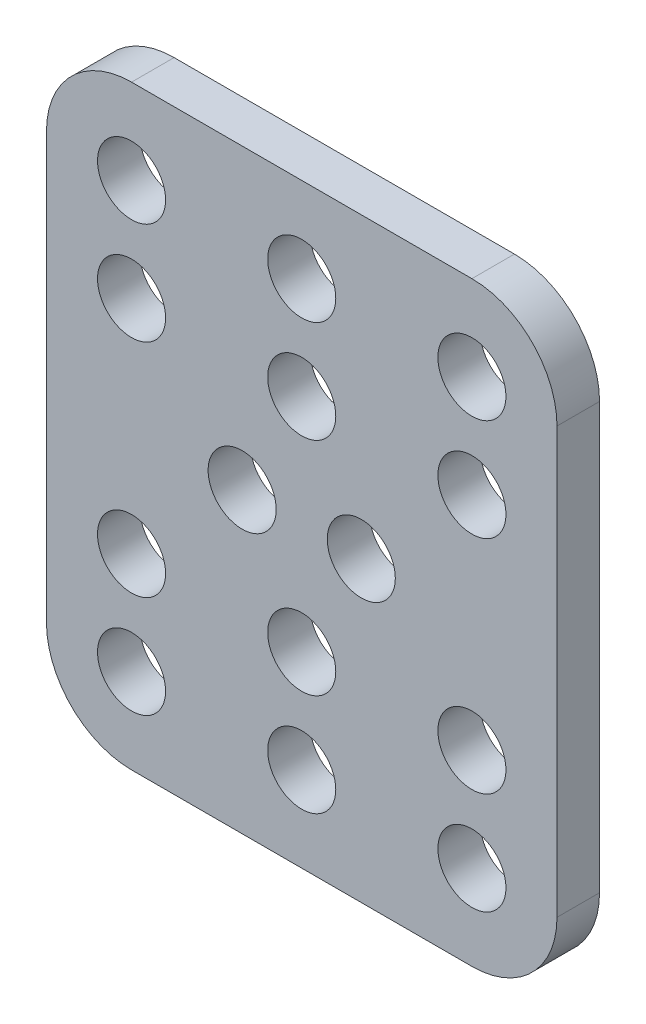
ISO-10303-21;
HEADER;
FILE_DESCRIPTION(('STEP AP214'),'2;1');
FILE_NAME('part.step','',(''),(''),'','','');
FILE_SCHEMA(('AUTOMOTIVE_DESIGN { 1 0 10303 214 1 1 1 1 }'));
ENDSEC;
DATA;
#1=APPLICATION_CONTEXT('core data for automotive mechanical design processes');
#2=APPLICATION_PROTOCOL_DEFINITION('international standard','automotive_design',2000,#1);
#3=PRODUCT_CONTEXT('',#1,'mechanical');
#4=PRODUCT('Part','Part','',(#3));
#5=PRODUCT_RELATED_PRODUCT_CATEGORY('part','',(#4));
#6=PRODUCT_DEFINITION_FORMATION('','',#4);
#7=PRODUCT_DEFINITION_CONTEXT('part definition',#1,'design');
#8=PRODUCT_DEFINITION('design','',#6,#7);
#9=PRODUCT_DEFINITION_SHAPE('','',#8);
#10=(LENGTH_UNIT() NAMED_UNIT(*) SI_UNIT(.MILLI.,.METRE.));
#11=(NAMED_UNIT(*) PLANE_ANGLE_UNIT() SI_UNIT($,.RADIAN.));
#12=(NAMED_UNIT(*) SI_UNIT($,.STERADIAN.) SOLID_ANGLE_UNIT());
#13=UNCERTAINTY_MEASURE_WITH_UNIT(LENGTH_MEASURE(1.E-05),#10,'distance_accuracy_value','');
#14=(GEOMETRIC_REPRESENTATION_CONTEXT(3) GLOBAL_UNCERTAINTY_ASSIGNED_CONTEXT((#13)) GLOBAL_UNIT_ASSIGNED_CONTEXT((#10,
#11,#12)) REPRESENTATION_CONTEXT('',''));
#15=CARTESIAN_POINT('',(0.,0.,0.));
#16=DIRECTION('',(0.,0.,1.));
#17=DIRECTION('',(1.,0.,0.));
#18=AXIS2_PLACEMENT_3D('',#15,#16,#17);
#19=CARTESIAN_POINT('',(-20.,-25.,5.));
#20=DIRECTION('',(0.,0.,1.));
#21=DIRECTION('',(1.,0.,0.));
#22=AXIS2_PLACEMENT_3D('',#19,#20,#21);
#23=PLANE('',#22);
#24=CARTESIAN_POINT('',(0.,13.,5.));
#25=DIRECTION('',(0.,0.,1.));
#26=DIRECTION('',(1.,0.,0.));
#27=AXIS2_PLACEMENT_3D('',#24,#25,#26);
#28=CIRCLE('',#27,4.);
#29=CARTESIAN_POINT('',(4.,13.,5.));
#30=VERTEX_POINT('',#29);
#31=EDGE_CURVE('E252',#30,#30,#28,.T.);
#32=ORIENTED_EDGE('',*,*,#31,.F.);
#33=EDGE_LOOP('',(#32));
#34=FACE_BOUND('',#33,.T.);
#35=CARTESIAN_POINT('',(20.,-13.,5.));
#36=DIRECTION('',(0.,0.,1.));
#37=DIRECTION('',(1.,0.,0.));
#38=AXIS2_PLACEMENT_3D('',#35,#36,#37);
#39=CIRCLE('',#38,4.);
#40=CARTESIAN_POINT('',(24.,-13.,5.));
#41=VERTEX_POINT('',#40);
#42=EDGE_CURVE('E240',#41,#41,#39,.T.);
#43=ORIENTED_EDGE('',*,*,#42,.F.);
#44=EDGE_LOOP('',(#43));
#45=FACE_BOUND('',#44,.T.);
#46=CARTESIAN_POINT('',(0.,25.,5.));
#47=DIRECTION('',(0.,0.,1.));
#48=DIRECTION('',(1.,0.,0.));
#49=AXIS2_PLACEMENT_3D('',#46,#47,#48);
#50=CIRCLE('',#49,4.);
#51=CARTESIAN_POINT('',(4.,25.,5.));
#52=VERTEX_POINT('',#51);
#53=EDGE_CURVE('E228',#52,#52,#50,.T.);
#54=ORIENTED_EDGE('',*,*,#53,.F.);
#55=EDGE_LOOP('',(#54));
#56=FACE_BOUND('',#55,.T.);
#57=CARTESIAN_POINT('',(0.,-25.,5.));
#58=DIRECTION('',(0.,0.,1.));
#59=DIRECTION('',(1.,0.,0.));
#60=AXIS2_PLACEMENT_3D('',#57,#58,#59);
#61=CIRCLE('',#60,4.);
#62=CARTESIAN_POINT('',(4.,-25.,5.));
#63=VERTEX_POINT('',#62);
#64=EDGE_CURVE('E216',#63,#63,#61,.T.);
#65=ORIENTED_EDGE('',*,*,#64,.F.);
#66=EDGE_LOOP('',(#65));
#67=FACE_BOUND('',#66,.T.);
#68=CARTESIAN_POINT('',(-20.,-25.,5.));
#69=DIRECTION('',(0.,0.,1.));
#70=DIRECTION('',(1.,0.,0.));
#71=AXIS2_PLACEMENT_3D('',#68,#69,#70);
#72=CIRCLE('',#71,4.);
#73=CARTESIAN_POINT('',(-16.,-25.,5.));
#74=VERTEX_POINT('',#73);
#75=EDGE_CURVE('E204',#74,#74,#72,.T.);
#76=ORIENTED_EDGE('',*,*,#75,.F.);
#77=EDGE_LOOP('',(#76));
#78=FACE_BOUND('',#77,.T.);
#79=CARTESIAN_POINT('',(-20.,25.,5.));
#80=DIRECTION('',(0.,0.,1.));
#81=DIRECTION('',(1.,0.,0.));
#82=AXIS2_PLACEMENT_3D('',#79,#80,#81);
#83=CIRCLE('',#82,4.);
#84=CARTESIAN_POINT('',(-16.,25.,5.));
#85=VERTEX_POINT('',#84);
#86=EDGE_CURVE('E192',#85,#85,#83,.T.);
#87=ORIENTED_EDGE('',*,*,#86,.F.);
#88=EDGE_LOOP('',(#87));
#89=FACE_BOUND('',#88,.T.);
#90=CARTESIAN_POINT('',(7.,0.,5.));
#91=DIRECTION('',(0.,0.,1.));
#92=DIRECTION('',(1.,0.,0.));
#93=AXIS2_PLACEMENT_3D('',#90,#91,#92);
#94=CIRCLE('',#93,4.);
#95=CARTESIAN_POINT('',(11.,0.,5.));
#96=VERTEX_POINT('',#95);
#97=EDGE_CURVE('E138',#96,#96,#94,.T.);
#98=ORIENTED_EDGE('',*,*,#97,.F.);
#99=EDGE_LOOP('',(#98));
#100=FACE_BOUND('',#99,.T.);
#101=CARTESIAN_POINT('',(-20.,-25.,5.));
#102=DIRECTION('',(0.,0.,1.));
#103=DIRECTION('',(1.,0.,0.));
#104=AXIS2_PLACEMENT_3D('',#101,#102,#103);
#105=CIRCLE('',#104,10.);
#106=CARTESIAN_POINT('',(-30.,-24.9999999999999,5.));
#107=VERTEX_POINT('',#106);
#108=CARTESIAN_POINT('',(-19.9999999999999,-35.,5.));
#109=VERTEX_POINT('',#108);
#110=EDGE_CURVE('E149',#107,#109,#105,.T.);
#111=ORIENTED_EDGE('',*,*,#110,.T.);
#112=DIRECTION('',(1.,0.,0.));
#113=VECTOR('',#112,1.);
#114=CARTESIAN_POINT('',(-19.9999999999999,-35.,5.));
#115=LINE('',#114,#113);
#116=CARTESIAN_POINT('',(19.9999999999999,-35.,5.));
#117=VERTEX_POINT('',#116);
#118=EDGE_CURVE('E97',#109,#117,#115,.T.);
#119=ORIENTED_EDGE('',*,*,#118,.T.);
#120=CARTESIAN_POINT('',(20.,-25.,5.));
#121=DIRECTION('',(0.,0.,1.));
#122=DIRECTION('',(1.,0.,0.));
#123=AXIS2_PLACEMENT_3D('',#120,#121,#122);
#124=CIRCLE('',#123,10.);
#125=CARTESIAN_POINT('',(30.,-24.9999999999999,5.));
#126=VERTEX_POINT('',#125);
#127=EDGE_CURVE('E164',#117,#126,#124,.T.);
#128=ORIENTED_EDGE('',*,*,#127,.T.);
#129=DIRECTION('',(0.,1.,0.));
#130=VECTOR('',#129,1.);
#131=CARTESIAN_POINT('',(30.,24.9999999999999,5.));
#132=LINE('',#131,#130);
#133=CARTESIAN_POINT('',(30.,24.9999999999999,5.));
#134=VERTEX_POINT('',#133);
#135=EDGE_CURVE('E177',#126,#134,#132,.T.);
#136=ORIENTED_EDGE('',*,*,#135,.T.);
#137=CARTESIAN_POINT('',(20.,25.,5.));
#138=DIRECTION('',(0.,0.,1.));
#139=DIRECTION('',(-1.,0.,0.));
#140=AXIS2_PLACEMENT_3D('',#137,#138,#139);
#141=CIRCLE('',#140,10.);
#142=CARTESIAN_POINT('',(19.9999999999999,35.,5.));
#143=VERTEX_POINT('',#142);
#144=EDGE_CURVE('E116',#134,#143,#141,.T.);
#145=ORIENTED_EDGE('',*,*,#144,.T.);
#146=DIRECTION('',(-1.,0.,0.));
#147=VECTOR('',#146,1.);
#148=CARTESIAN_POINT('',(-19.9999999999999,35.,5.));
#149=LINE('',#148,#147);
#150=CARTESIAN_POINT('',(-19.9999999999999,35.,5.));
#151=VERTEX_POINT('',#150);
#152=EDGE_CURVE('E110',#143,#151,#149,.T.);
#153=ORIENTED_EDGE('',*,*,#152,.T.);
#154=CARTESIAN_POINT('',(-20.,25.,5.));
#155=DIRECTION('',(0.,0.,1.));
#156=DIRECTION('',(1.,0.,0.));
#157=AXIS2_PLACEMENT_3D('',#154,#155,#156);
#158=CIRCLE('',#157,10.);
#159=CARTESIAN_POINT('',(-30.,24.9999999999999,5.));
#160=VERTEX_POINT('',#159);
#161=EDGE_CURVE('E114',#151,#160,#158,.T.);
#162=ORIENTED_EDGE('',*,*,#161,.T.);
#163=DIRECTION('',(0.,-1.,0.));
#164=VECTOR('',#163,1.);
#165=CARTESIAN_POINT('',(-30.,24.9999999999999,5.));
#166=LINE('',#165,#164);
#167=EDGE_CURVE('E54',#160,#107,#166,.T.);
#168=ORIENTED_EDGE('',*,*,#167,.T.);
#169=EDGE_LOOP('',(#111,#119,#128,#136,#145,#153,#162,#168));
#170=FACE_BOUND('',#169,.T.);
#171=CARTESIAN_POINT('',(-7.,0.,5.));
#172=DIRECTION('',(0.,0.,1.));
#173=DIRECTION('',(1.,0.,0.));
#174=AXIS2_PLACEMENT_3D('',#171,#172,#173);
#175=CIRCLE('',#174,4.);
#176=CARTESIAN_POINT('',(-3.,0.,5.));
#177=VERTEX_POINT('',#176);
#178=EDGE_CURVE('E186',#177,#177,#175,.T.);
#179=ORIENTED_EDGE('',*,*,#178,.F.);
#180=EDGE_LOOP('',(#179));
#181=FACE_BOUND('',#180,.T.);
#182=CARTESIAN_POINT('',(20.,25.,5.));
#183=DIRECTION('',(0.,0.,1.));
#184=DIRECTION('',(1.,0.,0.));
#185=AXIS2_PLACEMENT_3D('',#182,#183,#184);
#186=CIRCLE('',#185,4.);
#187=CARTESIAN_POINT('',(24.,25.,5.));
#188=VERTEX_POINT('',#187);
#189=EDGE_CURVE('E198',#188,#188,#186,.T.);
#190=ORIENTED_EDGE('',*,*,#189,.F.);
#191=EDGE_LOOP('',(#190));
#192=FACE_BOUND('',#191,.T.);
#193=CARTESIAN_POINT('',(20.,-25.,5.));
#194=DIRECTION('',(0.,0.,1.));
#195=DIRECTION('',(1.,0.,0.));
#196=AXIS2_PLACEMENT_3D('',#193,#194,#195);
#197=CIRCLE('',#196,4.);
#198=CARTESIAN_POINT('',(24.,-25.,5.));
#199=VERTEX_POINT('',#198);
#200=EDGE_CURVE('E210',#199,#199,#197,.T.);
#201=ORIENTED_EDGE('',*,*,#200,.F.);
#202=EDGE_LOOP('',(#201));
#203=FACE_BOUND('',#202,.T.);
#204=CARTESIAN_POINT('',(0.,-13.,5.));
#205=DIRECTION('',(0.,0.,1.));
#206=DIRECTION('',(1.,0.,0.));
#207=AXIS2_PLACEMENT_3D('',#204,#205,#206);
#208=CIRCLE('',#207,4.);
#209=CARTESIAN_POINT('',(4.,-13.,5.));
#210=VERTEX_POINT('',#209);
#211=EDGE_CURVE('E222',#210,#210,#208,.T.);
#212=ORIENTED_EDGE('',*,*,#211,.F.);
#213=EDGE_LOOP('',(#212));
#214=FACE_BOUND('',#213,.T.);
#215=CARTESIAN_POINT('',(-20.,-13.,5.));
#216=DIRECTION('',(0.,0.,1.));
#217=DIRECTION('',(1.,0.,0.));
#218=AXIS2_PLACEMENT_3D('',#215,#216,#217);
#219=CIRCLE('',#218,4.);
#220=CARTESIAN_POINT('',(-16.,-13.,5.));
#221=VERTEX_POINT('',#220);
#222=EDGE_CURVE('E234',#221,#221,#219,.T.);
#223=ORIENTED_EDGE('',*,*,#222,.F.);
#224=EDGE_LOOP('',(#223));
#225=FACE_BOUND('',#224,.T.);
#226=CARTESIAN_POINT('',(-20.,13.,5.));
#227=DIRECTION('',(0.,0.,1.));
#228=DIRECTION('',(1.,0.,0.));
#229=AXIS2_PLACEMENT_3D('',#226,#227,#228);
#230=CIRCLE('',#229,4.);
#231=CARTESIAN_POINT('',(-16.,13.,5.));
#232=VERTEX_POINT('',#231);
#233=EDGE_CURVE('E246',#232,#232,#230,.T.);
#234=ORIENTED_EDGE('',*,*,#233,.F.);
#235=EDGE_LOOP('',(#234));
#236=FACE_BOUND('',#235,.T.);
#237=CARTESIAN_POINT('',(20.,13.,5.));
#238=DIRECTION('',(0.,0.,1.));
#239=DIRECTION('',(1.,0.,0.));
#240=AXIS2_PLACEMENT_3D('',#237,#238,#239);
#241=CIRCLE('',#240,4.);
#242=CARTESIAN_POINT('',(24.,13.,5.));
#243=VERTEX_POINT('',#242);
#244=EDGE_CURVE('E258',#243,#243,#241,.T.);
#245=ORIENTED_EDGE('',*,*,#244,.F.);
#246=EDGE_LOOP('',(#245));
#247=FACE_BOUND('',#246,.T.);
#248=ADVANCED_FACE('F37',(#34,#45,#56,#67,#78,#89,#100,#170,#181,#192,#203,#214,#225,#236,#247),
#23,.T.);
#249=CARTESIAN_POINT('',(-20.,-25.,0.));
#250=DIRECTION('',(0.,0.,1.));
#251=DIRECTION('',(1.,0.,0.));
#252=AXIS2_PLACEMENT_3D('',#249,#250,#251);
#253=PLANE('',#252);
#254=CARTESIAN_POINT('',(-20.,-25.,0.));
#255=DIRECTION('',(0.,0.,1.));
#256=DIRECTION('',(1.,0.,0.));
#257=AXIS2_PLACEMENT_3D('',#254,#255,#256);
#258=CIRCLE('',#257,10.);
#259=CARTESIAN_POINT('',(-30.,-24.9999999999999,0.));
#260=VERTEX_POINT('',#259);
#261=CARTESIAN_POINT('',(-19.9999999999999,-35.,0.));
#262=VERTEX_POINT('',#261);
#263=EDGE_CURVE('E134',#260,#262,#258,.T.);
#264=ORIENTED_EDGE('',*,*,#263,.F.);
#265=DIRECTION('',(0.,-1.,0.));
#266=VECTOR('',#265,1.);
#267=CARTESIAN_POINT('',(-30.,24.9999999999999,0.));
#268=LINE('',#267,#266);
#269=CARTESIAN_POINT('',(-30.,24.9999999999999,0.));
#270=VERTEX_POINT('',#269);
#271=EDGE_CURVE('E89',#270,#260,#268,.T.);
#272=ORIENTED_EDGE('',*,*,#271,.F.);
#273=CARTESIAN_POINT('',(-20.,25.,0.));
#274=DIRECTION('',(0.,0.,1.));
#275=DIRECTION('',(1.,0.,0.));
#276=AXIS2_PLACEMENT_3D('',#273,#274,#275);
#277=CIRCLE('',#276,10.);
#278=CARTESIAN_POINT('',(-19.9999999999999,35.,0.));
#279=VERTEX_POINT('',#278);
#280=EDGE_CURVE('E83',#279,#270,#277,.T.);
#281=ORIENTED_EDGE('',*,*,#280,.F.);
#282=DIRECTION('',(-1.,0.,0.));
#283=VECTOR('',#282,1.);
#284=CARTESIAN_POINT('',(-19.9999999999999,35.,0.));
#285=LINE('',#284,#283);
#286=CARTESIAN_POINT('',(19.9999999999999,35.,0.));
#287=VERTEX_POINT('',#286);
#288=EDGE_CURVE('E124',#287,#279,#285,.T.);
#289=ORIENTED_EDGE('',*,*,#288,.F.);
#290=CARTESIAN_POINT('',(20.,25.,0.));
#291=DIRECTION('',(0.,0.,1.));
#292=DIRECTION('',(-1.,0.,0.));
#293=AXIS2_PLACEMENT_3D('',#290,#291,#292);
#294=CIRCLE('',#293,10.);
#295=CARTESIAN_POINT('',(30.,24.9999999999999,0.));
#296=VERTEX_POINT('',#295);
#297=EDGE_CURVE('E144',#296,#287,#294,.T.);
#298=ORIENTED_EDGE('',*,*,#297,.F.);
#299=DIRECTION('',(0.,1.,0.));
#300=VECTOR('',#299,1.);
#301=CARTESIAN_POINT('',(30.,24.9999999999999,0.));
#302=LINE('',#301,#300);
#303=CARTESIAN_POINT('',(30.,-24.9999999999999,0.));
#304=VERTEX_POINT('',#303);
#305=EDGE_CURVE('E142',#304,#296,#302,.T.);
#306=ORIENTED_EDGE('',*,*,#305,.F.);
#307=CARTESIAN_POINT('',(20.,-25.,0.));
#308=DIRECTION('',(0.,0.,1.));
#309=DIRECTION('',(1.,0.,0.));
#310=AXIS2_PLACEMENT_3D('',#307,#308,#309);
#311=CIRCLE('',#310,10.);
#312=CARTESIAN_POINT('',(19.9999999999999,-35.,0.));
#313=VERTEX_POINT('',#312);
#314=EDGE_CURVE('E140',#313,#304,#311,.T.);
#315=ORIENTED_EDGE('',*,*,#314,.F.);
#316=DIRECTION('',(1.,0.,0.));
#317=VECTOR('',#316,1.);
#318=CARTESIAN_POINT('',(-19.9999999999999,-35.,0.));
#319=LINE('',#318,#317);
#320=EDGE_CURVE('E137',#262,#313,#319,.T.);
#321=ORIENTED_EDGE('',*,*,#320,.F.);
#322=EDGE_LOOP('',(#264,#272,#281,#289,#298,#306,#315,#321));
#323=FACE_BOUND('',#322,.T.);
#324=CARTESIAN_POINT('',(7.,0.,0.));
#325=DIRECTION('',(0.,0.,1.));
#326=DIRECTION('',(1.,0.,0.));
#327=AXIS2_PLACEMENT_3D('',#324,#325,#326);
#328=CIRCLE('',#327,4.);
#329=CARTESIAN_POINT('',(11.,0.,0.));
#330=VERTEX_POINT('',#329);
#331=EDGE_CURVE('E183',#330,#330,#328,.T.);
#332=ORIENTED_EDGE('',*,*,#331,.T.);
#333=EDGE_LOOP('',(#332));
#334=FACE_BOUND('',#333,.T.);
#335=CARTESIAN_POINT('',(-7.,0.,0.));
#336=DIRECTION('',(0.,0.,1.));
#337=DIRECTION('',(1.,0.,0.));
#338=AXIS2_PLACEMENT_3D('',#335,#336,#337);
#339=CIRCLE('',#338,4.);
#340=CARTESIAN_POINT('',(-3.,0.,0.));
#341=VERTEX_POINT('',#340);
#342=EDGE_CURVE('E189',#341,#341,#339,.T.);
#343=ORIENTED_EDGE('',*,*,#342,.T.);
#344=EDGE_LOOP('',(#343));
#345=FACE_BOUND('',#344,.T.);
#346=CARTESIAN_POINT('',(-20.,25.,0.));
#347=DIRECTION('',(0.,0.,1.));
#348=DIRECTION('',(1.,0.,0.));
#349=AXIS2_PLACEMENT_3D('',#346,#347,#348);
#350=CIRCLE('',#349,4.);
#351=CARTESIAN_POINT('',(-16.,25.,0.));
#352=VERTEX_POINT('',#351);
#353=EDGE_CURVE('E195',#352,#352,#350,.T.);
#354=ORIENTED_EDGE('',*,*,#353,.T.);
#355=EDGE_LOOP('',(#354));
#356=FACE_BOUND('',#355,.T.);
#357=CARTESIAN_POINT('',(20.,25.,0.));
#358=DIRECTION('',(0.,0.,1.));
#359=DIRECTION('',(1.,0.,0.));
#360=AXIS2_PLACEMENT_3D('',#357,#358,#359);
#361=CIRCLE('',#360,4.);
#362=CARTESIAN_POINT('',(24.,25.,0.));
#363=VERTEX_POINT('',#362);
#364=EDGE_CURVE('E201',#363,#363,#361,.T.);
#365=ORIENTED_EDGE('',*,*,#364,.T.);
#366=EDGE_LOOP('',(#365));
#367=FACE_BOUND('',#366,.T.);
#368=CARTESIAN_POINT('',(-20.,-25.,0.));
#369=DIRECTION('',(0.,0.,1.));
#370=DIRECTION('',(1.,0.,0.));
#371=AXIS2_PLACEMENT_3D('',#368,#369,#370);
#372=CIRCLE('',#371,4.);
#373=CARTESIAN_POINT('',(-16.,-25.,0.));
#374=VERTEX_POINT('',#373);
#375=EDGE_CURVE('E207',#374,#374,#372,.T.);
#376=ORIENTED_EDGE('',*,*,#375,.T.);
#377=EDGE_LOOP('',(#376));
#378=FACE_BOUND('',#377,.T.);
#379=CARTESIAN_POINT('',(20.,-25.,0.));
#380=DIRECTION('',(0.,0.,1.));
#381=DIRECTION('',(1.,0.,0.));
#382=AXIS2_PLACEMENT_3D('',#379,#380,#381);
#383=CIRCLE('',#382,4.);
#384=CARTESIAN_POINT('',(24.,-25.,0.));
#385=VERTEX_POINT('',#384);
#386=EDGE_CURVE('E213',#385,#385,#383,.T.);
#387=ORIENTED_EDGE('',*,*,#386,.T.);
#388=EDGE_LOOP('',(#387));
#389=FACE_BOUND('',#388,.T.);
#390=CARTESIAN_POINT('',(0.,-25.,0.));
#391=DIRECTION('',(0.,0.,1.));
#392=DIRECTION('',(1.,0.,0.));
#393=AXIS2_PLACEMENT_3D('',#390,#391,#392);
#394=CIRCLE('',#393,4.);
#395=CARTESIAN_POINT('',(4.,-25.,0.));
#396=VERTEX_POINT('',#395);
#397=EDGE_CURVE('E219',#396,#396,#394,.T.);
#398=ORIENTED_EDGE('',*,*,#397,.T.);
#399=EDGE_LOOP('',(#398));
#400=FACE_BOUND('',#399,.T.);
#401=CARTESIAN_POINT('',(0.,-13.,0.));
#402=DIRECTION('',(0.,0.,1.));
#403=DIRECTION('',(1.,0.,0.));
#404=AXIS2_PLACEMENT_3D('',#401,#402,#403);
#405=CIRCLE('',#404,4.);
#406=CARTESIAN_POINT('',(4.,-13.,0.));
#407=VERTEX_POINT('',#406);
#408=EDGE_CURVE('E225',#407,#407,#405,.T.);
#409=ORIENTED_EDGE('',*,*,#408,.T.);
#410=EDGE_LOOP('',(#409));
#411=FACE_BOUND('',#410,.T.);
#412=CARTESIAN_POINT('',(0.,25.,0.));
#413=DIRECTION('',(0.,0.,1.));
#414=DIRECTION('',(1.,0.,0.));
#415=AXIS2_PLACEMENT_3D('',#412,#413,#414);
#416=CIRCLE('',#415,4.);
#417=CARTESIAN_POINT('',(4.,25.,0.));
#418=VERTEX_POINT('',#417);
#419=EDGE_CURVE('E231',#418,#418,#416,.T.);
#420=ORIENTED_EDGE('',*,*,#419,.T.);
#421=EDGE_LOOP('',(#420));
#422=FACE_BOUND('',#421,.T.);
#423=CARTESIAN_POINT('',(-20.,-13.,0.));
#424=DIRECTION('',(0.,0.,1.));
#425=DIRECTION('',(1.,0.,0.));
#426=AXIS2_PLACEMENT_3D('',#423,#424,#425);
#427=CIRCLE('',#426,4.);
#428=CARTESIAN_POINT('',(-16.,-13.,0.));
#429=VERTEX_POINT('',#428);
#430=EDGE_CURVE('E237',#429,#429,#427,.T.);
#431=ORIENTED_EDGE('',*,*,#430,.T.);
#432=EDGE_LOOP('',(#431));
#433=FACE_BOUND('',#432,.T.);
#434=CARTESIAN_POINT('',(20.,-13.,0.));
#435=DIRECTION('',(0.,0.,1.));
#436=DIRECTION('',(1.,0.,0.));
#437=AXIS2_PLACEMENT_3D('',#434,#435,#436);
#438=CIRCLE('',#437,4.);
#439=CARTESIAN_POINT('',(24.,-13.,0.));
#440=VERTEX_POINT('',#439);
#441=EDGE_CURVE('E243',#440,#440,#438,.T.);
#442=ORIENTED_EDGE('',*,*,#441,.T.);
#443=EDGE_LOOP('',(#442));
#444=FACE_BOUND('',#443,.T.);
#445=CARTESIAN_POINT('',(-20.,13.,0.));
#446=DIRECTION('',(0.,0.,1.));
#447=DIRECTION('',(1.,0.,0.));
#448=AXIS2_PLACEMENT_3D('',#445,#446,#447);
#449=CIRCLE('',#448,4.);
#450=CARTESIAN_POINT('',(-16.,13.,0.));
#451=VERTEX_POINT('',#450);
#452=EDGE_CURVE('E249',#451,#451,#449,.T.);
#453=ORIENTED_EDGE('',*,*,#452,.T.);
#454=EDGE_LOOP('',(#453));
#455=FACE_BOUND('',#454,.T.);
#456=CARTESIAN_POINT('',(0.,13.,0.));
#457=DIRECTION('',(0.,0.,1.));
#458=DIRECTION('',(1.,0.,0.));
#459=AXIS2_PLACEMENT_3D('',#456,#457,#458);
#460=CIRCLE('',#459,4.);
#461=CARTESIAN_POINT('',(4.,13.,0.));
#462=VERTEX_POINT('',#461);
#463=EDGE_CURVE('E255',#462,#462,#460,.T.);
#464=ORIENTED_EDGE('',*,*,#463,.T.);
#465=EDGE_LOOP('',(#464));
#466=FACE_BOUND('',#465,.T.);
#467=CARTESIAN_POINT('',(20.,13.,0.));
#468=DIRECTION('',(0.,0.,1.));
#469=DIRECTION('',(1.,0.,0.));
#470=AXIS2_PLACEMENT_3D('',#467,#468,#469);
#471=CIRCLE('',#470,4.);
#472=CARTESIAN_POINT('',(24.,13.,0.));
#473=VERTEX_POINT('',#472);
#474=EDGE_CURVE('E261',#473,#473,#471,.T.);
#475=ORIENTED_EDGE('',*,*,#474,.T.);
#476=EDGE_LOOP('',(#475));
#477=FACE_BOUND('',#476,.T.);
#478=ADVANCED_FACE('F168',(#323,#334,#345,#356,#367,#378,#389,#400,#411,#422,#433,#444,#455,
#466,#477),#253,.F.);
#479=CARTESIAN_POINT('',(-20.,-25.,5.));
#480=DIRECTION('',(0.,0.,-1.));
#481=DIRECTION('',(-1.,0.,0.));
#482=AXIS2_PLACEMENT_3D('',#479,#480,#481);
#483=CYLINDRICAL_SURFACE('',#482,10.);
#484=ORIENTED_EDGE('',*,*,#263,.T.);
#485=DIRECTION('',(0.,0.,-1.));
#486=VECTOR('',#485,1.);
#487=CARTESIAN_POINT('',(-19.9999999999999,-35.,5.));
#488=LINE('',#487,#486);
#489=EDGE_CURVE('E11',#109,#262,#488,.T.);
#490=ORIENTED_EDGE('',*,*,#489,.F.);
#491=ORIENTED_EDGE('',*,*,#110,.F.);
#492=DIRECTION('',(0.,0.,-1.));
#493=VECTOR('',#492,1.);
#494=CARTESIAN_POINT('',(-30.,-24.9999999999999,5.));
#495=LINE('',#494,#493);
#496=EDGE_CURVE('E130',#107,#260,#495,.T.);
#497=ORIENTED_EDGE('',*,*,#496,.T.);
#498=EDGE_LOOP('',(#484,#490,#491,#497));
#499=FACE_BOUND('',#498,.T.);
#500=ADVANCED_FACE('F39',(#499),#483,.T.);
#501=CARTESIAN_POINT('',(-19.9999999999999,-35.,5.));
#502=DIRECTION('',(0.,1.,0.));
#503=DIRECTION('',(0.,0.,1.));
#504=AXIS2_PLACEMENT_3D('',#501,#502,#503);
#505=PLANE('',#504);
#506=ORIENTED_EDGE('',*,*,#320,.T.);
#507=DIRECTION('',(0.,0.,-1.));
#508=VECTOR('',#507,1.);
#509=CARTESIAN_POINT('',(19.9999999999999,-35.,5.));
#510=LINE('',#509,#508);
#511=EDGE_CURVE('E46',#117,#313,#510,.T.);
#512=ORIENTED_EDGE('',*,*,#511,.F.);
#513=ORIENTED_EDGE('',*,*,#118,.F.);
#514=ORIENTED_EDGE('',*,*,#489,.T.);
#515=EDGE_LOOP('',(#506,#512,#513,#514));
#516=FACE_BOUND('',#515,.T.);
#517=ADVANCED_FACE('F295',(#516),#505,.F.);
#518=CARTESIAN_POINT('',(20.,-25.,5.));
#519=DIRECTION('',(0.,0.,-1.));
#520=DIRECTION('',(-1.,0.,0.));
#521=AXIS2_PLACEMENT_3D('',#518,#519,#520);
#522=CYLINDRICAL_SURFACE('',#521,10.);
#523=ORIENTED_EDGE('',*,*,#314,.T.);
#524=DIRECTION('',(0.,0.,-1.));
#525=VECTOR('',#524,1.);
#526=CARTESIAN_POINT('',(30.,-24.9999999999999,5.));
#527=LINE('',#526,#525);
#528=EDGE_CURVE('E156',#126,#304,#527,.T.);
#529=ORIENTED_EDGE('',*,*,#528,.F.);
#530=ORIENTED_EDGE('',*,*,#127,.F.);
#531=ORIENTED_EDGE('',*,*,#511,.T.);
#532=EDGE_LOOP('',(#523,#529,#530,#531));
#533=FACE_BOUND('',#532,.T.);
#534=ADVANCED_FACE('F162',(#533),#522,.T.);
#535=CARTESIAN_POINT('',(30.,24.9999999999999,5.));
#536=DIRECTION('',(-1.,0.,0.));
#537=DIRECTION('',(0.,0.,1.));
#538=AXIS2_PLACEMENT_3D('',#535,#536,#537);
#539=PLANE('',#538);
#540=ORIENTED_EDGE('',*,*,#305,.T.);
#541=DIRECTION('',(0.,0.,-1.));
#542=VECTOR('',#541,1.);
#543=CARTESIAN_POINT('',(30.,24.9999999999999,5.));
#544=LINE('',#543,#542);
#545=EDGE_CURVE('E153',#134,#296,#544,.T.);
#546=ORIENTED_EDGE('',*,*,#545,.F.);
#547=ORIENTED_EDGE('',*,*,#135,.F.);
#548=ORIENTED_EDGE('',*,*,#528,.T.);
#549=EDGE_LOOP('',(#540,#546,#547,#548));
#550=FACE_BOUND('',#549,.T.);
#551=ADVANCED_FACE('F173',(#550),#539,.F.);
#552=CARTESIAN_POINT('',(20.,25.,5.));
#553=DIRECTION('',(0.,0.,-1.));
#554=DIRECTION('',(-1.,0.,0.));
#555=AXIS2_PLACEMENT_3D('',#552,#553,#554);
#556=CYLINDRICAL_SURFACE('',#555,10.);
#557=ORIENTED_EDGE('',*,*,#297,.T.);
#558=DIRECTION('',(0.,0.,-1.));
#559=VECTOR('',#558,1.);
#560=CARTESIAN_POINT('',(19.9999999999999,35.,5.));
#561=LINE('',#560,#559);
#562=EDGE_CURVE('E125',#143,#287,#561,.T.);
#563=ORIENTED_EDGE('',*,*,#562,.F.);
#564=ORIENTED_EDGE('',*,*,#144,.F.);
#565=ORIENTED_EDGE('',*,*,#545,.T.);
#566=EDGE_LOOP('',(#557,#563,#564,#565));
#567=FACE_BOUND('',#566,.T.);
#568=ADVANCED_FACE('F176',(#567),#556,.T.);
#569=CARTESIAN_POINT('',(-19.9999999999999,35.,5.));
#570=DIRECTION('',(0.,-1.,0.));
#571=DIRECTION('',(0.,0.,-1.));
#572=AXIS2_PLACEMENT_3D('',#569,#570,#571);
#573=PLANE('',#572);
#574=ORIENTED_EDGE('',*,*,#288,.T.);
#575=DIRECTION('',(0.,0.,-1.));
#576=VECTOR('',#575,1.);
#577=CARTESIAN_POINT('',(-19.9999999999999,35.,5.));
#578=LINE('',#577,#576);
#579=EDGE_CURVE('E121',#151,#279,#578,.T.);
#580=ORIENTED_EDGE('',*,*,#579,.F.);
#581=ORIENTED_EDGE('',*,*,#152,.F.);
#582=ORIENTED_EDGE('',*,*,#562,.T.);
#583=EDGE_LOOP('',(#574,#580,#581,#582));
#584=FACE_BOUND('',#583,.T.);
#585=ADVANCED_FACE('F122',(#584),#573,.F.);
#586=CARTESIAN_POINT('',(-20.,25.,5.));
#587=DIRECTION('',(0.,0.,-1.));
#588=DIRECTION('',(-1.,0.,0.));
#589=AXIS2_PLACEMENT_3D('',#586,#587,#588);
#590=CYLINDRICAL_SURFACE('',#589,10.);
#591=ORIENTED_EDGE('',*,*,#280,.T.);
#592=DIRECTION('',(0.,0.,-1.));
#593=VECTOR('',#592,1.);
#594=CARTESIAN_POINT('',(-30.,24.9999999999999,5.));
#595=LINE('',#594,#593);
#596=EDGE_CURVE('E126',#160,#270,#595,.T.);
#597=ORIENTED_EDGE('',*,*,#596,.F.);
#598=ORIENTED_EDGE('',*,*,#161,.F.);
#599=ORIENTED_EDGE('',*,*,#579,.T.);
#600=EDGE_LOOP('',(#591,#597,#598,#599));
#601=FACE_BOUND('',#600,.T.);
#602=ADVANCED_FACE('F128',(#601),#590,.T.);
#603=CARTESIAN_POINT('',(-30.,24.9999999999999,5.));
#604=DIRECTION('',(1.,0.,0.));
#605=DIRECTION('',(0.,1.,0.));
#606=AXIS2_PLACEMENT_3D('',#603,#604,#605);
#607=PLANE('',#606);
#608=ORIENTED_EDGE('',*,*,#271,.T.);
#609=ORIENTED_EDGE('',*,*,#496,.F.);
#610=ORIENTED_EDGE('',*,*,#167,.F.);
#611=ORIENTED_EDGE('',*,*,#596,.T.);
#612=EDGE_LOOP('',(#608,#609,#610,#611));
#613=FACE_BOUND('',#612,.T.);
#614=ADVANCED_FACE('F283',(#613),#607,.F.);
#615=CARTESIAN_POINT('',(7.,0.,5.));
#616=DIRECTION('',(0.,0.,-1.));
#617=DIRECTION('',(-1.,0.,0.));
#618=AXIS2_PLACEMENT_3D('',#615,#616,#617);
#619=CYLINDRICAL_SURFACE('',#618,4.);
#620=ORIENTED_EDGE('',*,*,#97,.T.);
#621=EDGE_LOOP('',(#620));
#622=FACE_BOUND('',#621,.T.);
#623=ORIENTED_EDGE('',*,*,#331,.F.);
#624=EDGE_LOOP('',(#623));
#625=FACE_BOUND('',#624,.T.);
#626=ADVANCED_FACE('F280',(#622,#625),#619,.F.);
#627=CARTESIAN_POINT('',(-7.,0.,5.));
#628=DIRECTION('',(0.,0.,-1.));
#629=DIRECTION('',(-1.,0.,0.));
#630=AXIS2_PLACEMENT_3D('',#627,#628,#629);
#631=CYLINDRICAL_SURFACE('',#630,4.);
#632=ORIENTED_EDGE('',*,*,#178,.T.);
#633=EDGE_LOOP('',(#632));
#634=FACE_BOUND('',#633,.T.);
#635=ORIENTED_EDGE('',*,*,#342,.F.);
#636=EDGE_LOOP('',(#635));
#637=FACE_BOUND('',#636,.T.);
#638=ADVANCED_FACE('F359',(#634,#637),#631,.F.);
#639=CARTESIAN_POINT('',(-20.,25.,5.));
#640=DIRECTION('',(0.,0.,-1.));
#641=DIRECTION('',(-1.,0.,0.));
#642=AXIS2_PLACEMENT_3D('',#639,#640,#641);
#643=CYLINDRICAL_SURFACE('',#642,4.);
#644=ORIENTED_EDGE('',*,*,#86,.T.);
#645=EDGE_LOOP('',(#644));
#646=FACE_BOUND('',#645,.T.);
#647=ORIENTED_EDGE('',*,*,#353,.F.);
#648=EDGE_LOOP('',(#647));
#649=FACE_BOUND('',#648,.T.);
#650=ADVANCED_FACE('F367',(#646,#649),#643,.F.);
#651=CARTESIAN_POINT('',(20.,25.,5.));
#652=DIRECTION('',(0.,0.,-1.));
#653=DIRECTION('',(-1.,0.,0.));
#654=AXIS2_PLACEMENT_3D('',#651,#652,#653);
#655=CYLINDRICAL_SURFACE('',#654,4.);
#656=ORIENTED_EDGE('',*,*,#189,.T.);
#657=EDGE_LOOP('',(#656));
#658=FACE_BOUND('',#657,.T.);
#659=ORIENTED_EDGE('',*,*,#364,.F.);
#660=EDGE_LOOP('',(#659));
#661=FACE_BOUND('',#660,.T.);
#662=ADVANCED_FACE('F375',(#658,#661),#655,.F.);
#663=CARTESIAN_POINT('',(-20.,-25.,5.));
#664=DIRECTION('',(0.,0.,-1.));
#665=DIRECTION('',(-1.,0.,0.));
#666=AXIS2_PLACEMENT_3D('',#663,#664,#665);
#667=CYLINDRICAL_SURFACE('',#666,4.);
#668=ORIENTED_EDGE('',*,*,#75,.T.);
#669=EDGE_LOOP('',(#668));
#670=FACE_BOUND('',#669,.T.);
#671=ORIENTED_EDGE('',*,*,#375,.F.);
#672=EDGE_LOOP('',(#671));
#673=FACE_BOUND('',#672,.T.);
#674=ADVANCED_FACE('F384',(#670,#673),#667,.F.);
#675=CARTESIAN_POINT('',(20.,-25.,5.));
#676=DIRECTION('',(0.,0.,-1.));
#677=DIRECTION('',(-1.,0.,0.));
#678=AXIS2_PLACEMENT_3D('',#675,#676,#677);
#679=CYLINDRICAL_SURFACE('',#678,4.);
#680=ORIENTED_EDGE('',*,*,#200,.T.);
#681=EDGE_LOOP('',(#680));
#682=FACE_BOUND('',#681,.T.);
#683=ORIENTED_EDGE('',*,*,#386,.F.);
#684=EDGE_LOOP('',(#683));
#685=FACE_BOUND('',#684,.T.);
#686=ADVANCED_FACE('F393',(#682,#685),#679,.F.);
#687=CARTESIAN_POINT('',(0.,-25.,5.));
#688=DIRECTION('',(0.,0.,-1.));
#689=DIRECTION('',(-1.,0.,0.));
#690=AXIS2_PLACEMENT_3D('',#687,#688,#689);
#691=CYLINDRICAL_SURFACE('',#690,4.);
#692=ORIENTED_EDGE('',*,*,#64,.T.);
#693=EDGE_LOOP('',(#692));
#694=FACE_BOUND('',#693,.T.);
#695=ORIENTED_EDGE('',*,*,#397,.F.);
#696=EDGE_LOOP('',(#695));
#697=FACE_BOUND('',#696,.T.);
#698=ADVANCED_FACE('F402',(#694,#697),#691,.F.);
#699=CARTESIAN_POINT('',(0.,-13.,5.));
#700=DIRECTION('',(0.,0.,-1.));
#701=DIRECTION('',(-1.,0.,0.));
#702=AXIS2_PLACEMENT_3D('',#699,#700,#701);
#703=CYLINDRICAL_SURFACE('',#702,4.);
#704=ORIENTED_EDGE('',*,*,#211,.T.);
#705=EDGE_LOOP('',(#704));
#706=FACE_BOUND('',#705,.T.);
#707=ORIENTED_EDGE('',*,*,#408,.F.);
#708=EDGE_LOOP('',(#707));
#709=FACE_BOUND('',#708,.T.);
#710=ADVANCED_FACE('F411',(#706,#709),#703,.F.);
#711=CARTESIAN_POINT('',(0.,25.,5.));
#712=DIRECTION('',(0.,0.,-1.));
#713=DIRECTION('',(-1.,0.,0.));
#714=AXIS2_PLACEMENT_3D('',#711,#712,#713);
#715=CYLINDRICAL_SURFACE('',#714,4.);
#716=ORIENTED_EDGE('',*,*,#53,.T.);
#717=EDGE_LOOP('',(#716));
#718=FACE_BOUND('',#717,.T.);
#719=ORIENTED_EDGE('',*,*,#419,.F.);
#720=EDGE_LOOP('',(#719));
#721=FACE_BOUND('',#720,.T.);
#722=ADVANCED_FACE('F420',(#718,#721),#715,.F.);
#723=CARTESIAN_POINT('',(-20.,-13.,5.));
#724=DIRECTION('',(0.,0.,-1.));
#725=DIRECTION('',(-1.,0.,0.));
#726=AXIS2_PLACEMENT_3D('',#723,#724,#725);
#727=CYLINDRICAL_SURFACE('',#726,4.);
#728=ORIENTED_EDGE('',*,*,#222,.T.);
#729=EDGE_LOOP('',(#728));
#730=FACE_BOUND('',#729,.T.);
#731=ORIENTED_EDGE('',*,*,#430,.F.);
#732=EDGE_LOOP('',(#731));
#733=FACE_BOUND('',#732,.T.);
#734=ADVANCED_FACE('F429',(#730,#733),#727,.F.);
#735=CARTESIAN_POINT('',(20.,-13.,5.));
#736=DIRECTION('',(0.,0.,-1.));
#737=DIRECTION('',(-1.,0.,0.));
#738=AXIS2_PLACEMENT_3D('',#735,#736,#737);
#739=CYLINDRICAL_SURFACE('',#738,4.);
#740=ORIENTED_EDGE('',*,*,#42,.T.);
#741=EDGE_LOOP('',(#740));
#742=FACE_BOUND('',#741,.T.);
#743=ORIENTED_EDGE('',*,*,#441,.F.);
#744=EDGE_LOOP('',(#743));
#745=FACE_BOUND('',#744,.T.);
#746=ADVANCED_FACE('F438',(#742,#745),#739,.F.);
#747=CARTESIAN_POINT('',(-20.,13.,5.));
#748=DIRECTION('',(0.,0.,-1.));
#749=DIRECTION('',(-1.,0.,0.));
#750=AXIS2_PLACEMENT_3D('',#747,#748,#749);
#751=CYLINDRICAL_SURFACE('',#750,4.);
#752=ORIENTED_EDGE('',*,*,#233,.T.);
#753=EDGE_LOOP('',(#752));
#754=FACE_BOUND('',#753,.T.);
#755=ORIENTED_EDGE('',*,*,#452,.F.);
#756=EDGE_LOOP('',(#755));
#757=FACE_BOUND('',#756,.T.);
#758=ADVANCED_FACE('F447',(#754,#757),#751,.F.);
#759=CARTESIAN_POINT('',(0.,13.,5.));
#760=DIRECTION('',(0.,0.,-1.));
#761=DIRECTION('',(-1.,0.,0.));
#762=AXIS2_PLACEMENT_3D('',#759,#760,#761);
#763=CYLINDRICAL_SURFACE('',#762,4.);
#764=ORIENTED_EDGE('',*,*,#31,.T.);
#765=EDGE_LOOP('',(#764));
#766=FACE_BOUND('',#765,.T.);
#767=ORIENTED_EDGE('',*,*,#463,.F.);
#768=EDGE_LOOP('',(#767));
#769=FACE_BOUND('',#768,.T.);
#770=ADVANCED_FACE('F456',(#766,#769),#763,.F.);
#771=CARTESIAN_POINT('',(20.,13.,5.));
#772=DIRECTION('',(0.,0.,-1.));
#773=DIRECTION('',(-1.,0.,0.));
#774=AXIS2_PLACEMENT_3D('',#771,#772,#773);
#775=CYLINDRICAL_SURFACE('',#774,4.);
#776=ORIENTED_EDGE('',*,*,#244,.T.);
#777=EDGE_LOOP('',(#776));
#778=FACE_BOUND('',#777,.T.);
#779=ORIENTED_EDGE('',*,*,#474,.F.);
#780=EDGE_LOOP('',(#779));
#781=FACE_BOUND('',#780,.T.);
#782=ADVANCED_FACE('F267',(#778,#781),#775,.F.);
#783=CLOSED_SHELL('',(#248,#478,#500,#517,#534,#551,#568,#585,#602,#614,#626,#638,#650,#662,
#674,#686,#698,#710,#722,#734,#746,#758,#770,#782));
#784=MANIFOLD_SOLID_BREP('B2',#783);
#785=ADVANCED_BREP_SHAPE_REPRESENTATION('',(#18,#784),#14);
#786=SHAPE_DEFINITION_REPRESENTATION(#9,#785);
ENDSEC;
END-ISO-10303-21;
